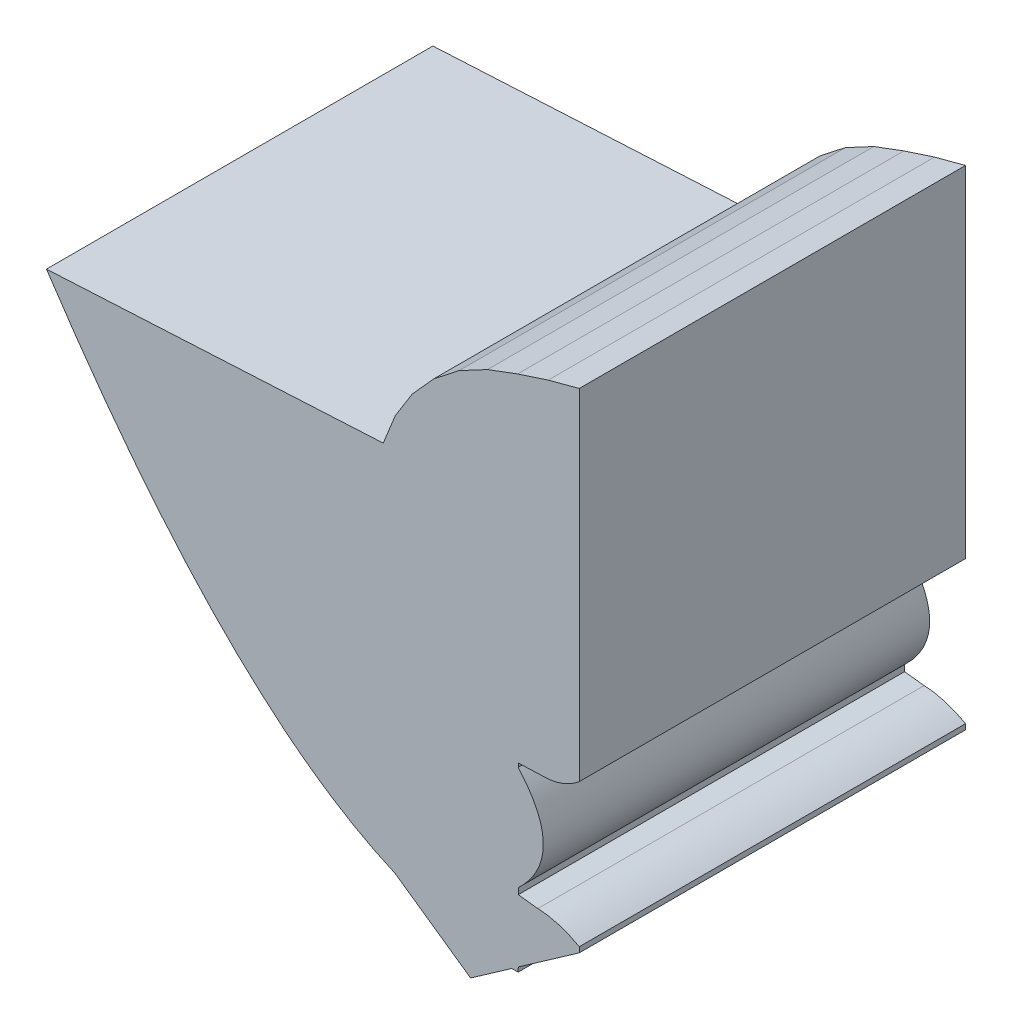
ISO-10303-21;
HEADER;
FILE_DESCRIPTION(('STEP AP214'),'2;1');
FILE_NAME('part.step','',(''),(''),'','','');
FILE_SCHEMA(('AUTOMOTIVE_DESIGN { 1 0 10303 214 1 1 1 1 }'));
ENDSEC;
DATA;
#1=APPLICATION_CONTEXT('core data for automotive mechanical design processes');
#2=APPLICATION_PROTOCOL_DEFINITION('international standard','automotive_design',2000,#1);
#3=PRODUCT_CONTEXT('',#1,'mechanical');
#4=PRODUCT('Part','Part','',(#3));
#5=PRODUCT_RELATED_PRODUCT_CATEGORY('part','',(#4));
#6=PRODUCT_DEFINITION_FORMATION('','',#4);
#7=PRODUCT_DEFINITION_CONTEXT('part definition',#1,'design');
#8=PRODUCT_DEFINITION('design','',#6,#7);
#9=PRODUCT_DEFINITION_SHAPE('','',#8);
#10=(LENGTH_UNIT() NAMED_UNIT(*) SI_UNIT(.MILLI.,.METRE.));
#11=(NAMED_UNIT(*) PLANE_ANGLE_UNIT() SI_UNIT($,.RADIAN.));
#12=(NAMED_UNIT(*) SI_UNIT($,.STERADIAN.) SOLID_ANGLE_UNIT());
#13=UNCERTAINTY_MEASURE_WITH_UNIT(LENGTH_MEASURE(1.E-05),#10,'distance_accuracy_value','');
#14=(GEOMETRIC_REPRESENTATION_CONTEXT(3) GLOBAL_UNCERTAINTY_ASSIGNED_CONTEXT((#13)) GLOBAL_UNIT_ASSIGNED_CONTEXT((#10,
#11,#12)) REPRESENTATION_CONTEXT('',''));
#15=CARTESIAN_POINT('',(0.,0.,0.));
#16=DIRECTION('',(0.,0.,1.));
#17=DIRECTION('',(1.,0.,0.));
#18=AXIS2_PLACEMENT_3D('',#15,#16,#17);
#19=CARTESIAN_POINT('',(-2.17733041778456,0.,7.21));
#20=DIRECTION('',(1.,0.,0.));
#21=DIRECTION('',(0.,1.,0.));
#22=AXIS2_PLACEMENT_3D('',#19,#20,#21);
#23=PLANE('',#22);
#24=DIRECTION('',(0.,1.,0.));
#25=VECTOR('',#24,1.);
#26=CARTESIAN_POINT('',(-2.17733041778456,0.,7.21));
#27=LINE('',#26,#25);
#28=CARTESIAN_POINT('',(-2.17733041779455,-1.68817652024789,7.21));
#29=VERTEX_POINT('',#28);
#30=CARTESIAN_POINT('',(-2.17733041778456,-1.91644819901776,7.21));
#31=VERTEX_POINT('',#30);
#32=EDGE_CURVE('E339',#29,#31,#27,.F.);
#33=ORIENTED_EDGE('',*,*,#32,.T.);
#34=DIRECTION('',(0.,0.,-1.));
#35=VECTOR('',#34,1.);
#36=CARTESIAN_POINT('',(-2.17733041778456,-1.91644819901776,7.21));
#37=LINE('',#36,#35);
#38=CARTESIAN_POINT('',(-2.17733041778456,-1.91644819901776,-7.21));
#39=VERTEX_POINT('',#38);
#40=EDGE_CURVE('E13',#31,#39,#37,.T.);
#41=ORIENTED_EDGE('',*,*,#40,.T.);
#42=DIRECTION('',(0.,1.,0.));
#43=VECTOR('',#42,1.);
#44=CARTESIAN_POINT('',(-2.17733041778456,0.,-7.21));
#45=LINE('',#44,#43);
#46=CARTESIAN_POINT('',(-2.17733041778456,-1.68817652020115,-7.21));
#47=VERTEX_POINT('',#46);
#48=EDGE_CURVE('E238',#47,#39,#45,.F.);
#49=ORIENTED_EDGE('',*,*,#48,.F.);
#50=DIRECTION('',(0.,0.,-1.));
#51=VECTOR('',#50,1.);
#52=CARTESIAN_POINT('',(-2.17733041778328,-1.68817652023794,30.8299178698776));
#53=LINE('',#52,#51);
#54=EDGE_CURVE('E627',#29,#47,#53,.T.);
#55=ORIENTED_EDGE('',*,*,#54,.F.);
#56=EDGE_LOOP('',(#33,#41,#49,#55));
#57=FACE_BOUND('',#56,.T.);
#58=ADVANCED_FACE('F59',(#57),#23,.T.);
#59=CARTESIAN_POINT('',(-2.17733041778456,-4.25341499115567,-7.21));
#60=VERTEX_POINT('',#59);
#61=CARTESIAN_POINT('',(-2.17733041883694,-4.4181521924004,-7.21253661769719));
#62=VERTEX_POINT('',#61);
#63=EDGE_CURVE('E312',#60,#62,#45,.F.);
#64=ORIENTED_EDGE('',*,*,#63,.F.);
#65=DIRECTION('',(0.,0.,1.));
#66=VECTOR('',#65,1.);
#67=CARTESIAN_POINT('',(-2.17733041778456,-4.25341499115567,7.21));
#68=LINE('',#67,#66);
#69=CARTESIAN_POINT('',(-2.17733041778456,-4.25341499115567,7.21));
#70=VERTEX_POINT('',#69);
#71=EDGE_CURVE('E273',#60,#70,#68,.T.);
#72=ORIENTED_EDGE('',*,*,#71,.T.);
#73=CARTESIAN_POINT('',(-2.17733041778728,-4.418152192393,7.21251805157701));
#74=VERTEX_POINT('',#73);
#75=EDGE_CURVE('E317',#70,#74,#27,.F.);
#76=ORIENTED_EDGE('',*,*,#75,.T.);
#77=DIRECTION('',(0.,0.,1.));
#78=VECTOR('',#77,1.);
#79=CARTESIAN_POINT('',(-2.17733041988932,-4.41815219245795,-7.21507323539439));
#80=LINE('',#79,#78);
#81=EDGE_CURVE('E544',#62,#74,#80,.T.);
#82=ORIENTED_EDGE('',*,*,#81,.F.);
#83=EDGE_LOOP('',(#64,#72,#76,#82));
#84=FACE_BOUND('',#83,.T.);
#85=ADVANCED_FACE('F370',(#84),#23,.T.);
#86=CARTESIAN_POINT('',(-82931.1005830976,996560.072871644,30.8299178698776));
#87=CARTESIAN_POINT('',(87153.8887538027,-996199.093812144,30.8299178698776));
#88=CARTESIAN_POINT('',(-91384.0928999308,995820.531871049,30.8299178698776));
#89=B_SPLINE_CURVE_WITH_KNOTS('',2,(#86,#87,#88),.UNSPECIFIED.,.F.,.F.,(3,3),(0.,1.),.UNSPECIFIED.);
#90=DIRECTION('',(0.,0.,-1.));
#91=VECTOR('',#90,1.);
#92=SURFACE_OF_LINEAR_EXTRUSION('',#89,#91);
#93=CARTESIAN_POINT('',(-10.336006015882,-1.39847805226789,-7.21));
#94=CARTESIAN_POINT('',(-8.5284539138062,-2.77531421287891,-7.21));
#95=CARTESIAN_POINT('',(-6.77560980561953,-3.52683514195856,-7.21));
#96=B_SPLINE_CURVE_WITH_KNOTS('',2,(#93,#94,#95),.UNSPECIFIED.,.F.,.F.,(3,3),(0.500568886188035,
0.500965025000237),.UNSPECIFIED.);
#97=CARTESIAN_POINT('',(-10.3360060158632,-1.39847805228234,-7.2125366176972));
#98=VERTEX_POINT('',#97);
#99=CARTESIAN_POINT('',(-6.77560979461232,-3.52683512639348,-7.21));
#100=VERTEX_POINT('',#99);
#101=EDGE_CURVE('E306',#98,#100,#96,.T.);
#102=ORIENTED_EDGE('',*,*,#101,.T.);
#103=DIRECTION('',(0.,0.,-1.));
#104=VECTOR('',#103,1.);
#105=CARTESIAN_POINT('',(-6.77560971984814,-3.52683517873603,0.));
#106=LINE('',#105,#104);
#107=CARTESIAN_POINT('',(-6.77560973251232,-3.52683516987637,7.21));
#108=VERTEX_POINT('',#107);
#109=EDGE_CURVE('E65',#100,#108,#106,.F.);
#110=ORIENTED_EDGE('',*,*,#109,.T.);
#111=CARTESIAN_POINT('',(-6.77560973443359,-3.52683517247104,7.21));
#112=CARTESIAN_POINT('',(-8.52845387710263,-2.7753142408292,7.21));
#113=CARTESIAN_POINT('',(-10.3360060158826,-1.39847805226063,7.21));
#114=B_SPLINE_CURVE_WITH_KNOTS('',2,(#111,#112,#113),.UNSPECIFIED.,.F.,.F.,(3,3),
(0.500568886179991,0.500965025000236),.UNSPECIFIED.);
#115=CARTESIAN_POINT('',(-10.3360060158816,-1.39847805227263,7.21251805157951));
#116=VERTEX_POINT('',#115);
#117=EDGE_CURVE('E474',#116,#108,#114,.F.);
#118=ORIENTED_EDGE('',*,*,#117,.F.);
#119=CARTESIAN_POINT('',(-10.336006015861,-1.39847805228632,7.21));
#120=CARTESIAN_POINT('',(-10.6228848167366,-1.17995870432205,7.21));
#121=CARTESIAN_POINT('',(-10.9111416710362,-0.945688133646021,7.21));
#122=B_SPLINE_CURVE_WITH_KNOTS('',2,(#119,#120,#121),.UNSPECIFIED.,.F.,.F.,(3,3),
(0.500965025000234,0.501027896674745),.UNSPECIFIED.);
#123=CARTESIAN_POINT('',(-10.9111416711035,-0.945688133586594,7.21251805157951));
#124=VERTEX_POINT('',#123);
#125=EDGE_CURVE('E332',#124,#116,#122,.F.);
#126=ORIENTED_EDGE('',*,*,#125,.F.);
#127=CARTESIAN_POINT('',(-10.9111416711694,-0.945688133531575,7.21));
#128=CARTESIAN_POINT('',(-15.1971813204195,2.53763911301365,7.21));
#129=CARTESIAN_POINT('',(-19.7878835648669,9.50327575735757,7.21));
#130=B_SPLINE_CURVE_WITH_KNOTS('',2,(#127,#128,#129),.UNSPECIFIED.,.F.,.F.,(3,3),
(0.501027896674761,0.501962724366634),.UNSPECIFIED.);
#131=CARTESIAN_POINT('',(-19.7878835648708,9.50327575735899,7.21251805157951));
#132=VERTEX_POINT('',#131);
#133=EDGE_CURVE('E347',#132,#124,#130,.F.);
#134=ORIENTED_EDGE('',*,*,#133,.F.);
#135=DIRECTION('',(0.,0.,1.));
#136=VECTOR('',#135,1.);
#137=CARTESIAN_POINT('',(-19.7878835648708,9.50327575735899,-7.21507323539439));
#138=LINE('',#137,#136);
#139=CARTESIAN_POINT('',(-19.7878835648708,9.50327575735899,-7.21253661769719));
#140=VERTEX_POINT('',#139);
#141=EDGE_CURVE('E472',#140,#132,#138,.T.);
#142=ORIENTED_EDGE('',*,*,#141,.F.);
#143=CARTESIAN_POINT('',(-19.7878835648714,9.50327575734023,-7.21));
#144=CARTESIAN_POINT('',(-15.197181319061,2.53763911092818,-7.21));
#145=CARTESIAN_POINT('',(-10.9111416686287,-0.945688135617351,-7.21));
#146=B_SPLINE_CURVE_WITH_KNOTS('',2,(#143,#144,#145),.UNSPECIFIED.,.F.,.F.,(3,3),
(0.501027896674483,0.501962724366634),.UNSPECIFIED.);
#147=CARTESIAN_POINT('',(-10.9111416684846,-0.945688135711886,-7.21253661769719));
#148=VERTEX_POINT('',#147);
#149=EDGE_CURVE('E466',#140,#148,#146,.T.);
#150=ORIENTED_EDGE('',*,*,#149,.T.);
#151=CARTESIAN_POINT('',(-10.9111416684921,-0.945688135713634,-7.21));
#152=CARTESIAN_POINT('',(-10.6228848154707,-1.17995870528634,-7.21));
#153=CARTESIAN_POINT('',(-10.336006015861,-1.39847805228632,-7.21));
#154=B_SPLINE_CURVE_WITH_KNOTS('',2,(#151,#152,#153),.UNSPECIFIED.,.F.,.F.,(3,3),
(0.500965025000234,0.501027896674468),.UNSPECIFIED.);
#155=EDGE_CURVE('E314',#148,#98,#154,.T.);
#156=ORIENTED_EDGE('',*,*,#155,.T.);
#157=EDGE_LOOP('',(#102,#110,#118,#126,#134,#142,#150,#156));
#158=FACE_BOUND('',#157,.T.);
#159=ADVANCED_FACE('F354',(#158),#92,.T.);
#160=CARTESIAN_POINT('',(-2.17733041779322,-4.41815219232809,7.21));
#161=CARTESIAN_POINT('',(-2.30147491297572,-4.42452331167626,7.21));
#162=CARTESIAN_POINT('',(-2.42591830275153,-4.42747805018972,7.21));
#163=B_SPLINE_CURVE_WITH_KNOTS('',2,(#160,#161,#162),.UNSPECIFIED.,.F.,.F.,(3,3),
(0.500038190982026,0.500067471653357),.UNSPECIFIED.);
#164=CARTESIAN_POINT('',(-2.42591825101224,-4.42747806588916,7.21));
#165=VERTEX_POINT('',#164);
#166=EDGE_CURVE('E453',#165,#74,#163,.F.);
#167=ORIENTED_EDGE('',*,*,#166,.F.);
#168=DIRECTION('',(0.,0.,-1.));
#169=VECTOR('',#168,1.);
#170=CARTESIAN_POINT('',(-2.42591822599403,-4.42747804839952,0.));
#171=LINE('',#170,#169);
#172=CARTESIAN_POINT('',(-2.42591830621238,-4.42747805028808,-7.21));
#173=VERTEX_POINT('',#172);
#174=EDGE_CURVE('E302',#165,#173,#171,.T.);
#175=ORIENTED_EDGE('',*,*,#174,.T.);
#176=CARTESIAN_POINT('',(-2.4259183062126,-4.42747805029424,-7.21));
#177=CARTESIAN_POINT('',(-2.30147491575222,-4.42452331181212,-7.21));
#178=CARTESIAN_POINT('',(-2.17733041988843,-4.41815219245793,-7.21));
#179=B_SPLINE_CURVE_WITH_KNOTS('',2,(#176,#177,#178),.UNSPECIFIED.,.F.,.F.,(3,3),
(0.500038190982273,0.500067471653765),.UNSPECIFIED.);
#180=EDGE_CURVE('E292',#173,#62,#179,.T.);
#181=ORIENTED_EDGE('',*,*,#180,.T.);
#182=ORIENTED_EDGE('',*,*,#81,.T.);
#183=EDGE_LOOP('',(#167,#175,#181,#182));
#184=FACE_BOUND('',#183,.T.);
#185=ADVANCED_FACE('F366',(#184),#92,.T.);
#186=DIRECTION('',(0.,1.,0.));
#187=VECTOR('',#186,1.);
#188=CARTESIAN_POINT('',(-2.17733041778456,0.,-7.21));
#189=LINE('',#188,#187);
#190=CARTESIAN_POINT('',(-2.17733041778456,2.34248700715526,-7.21));
#191=VERTEX_POINT('',#190);
#192=CARTESIAN_POINT('',(-2.17733041777607,2.20172974209443,-7.21));
#193=VERTEX_POINT('',#192);
#194=EDGE_CURVE('E326',#191,#193,#189,.F.);
#195=ORIENTED_EDGE('',*,*,#194,.F.);
#196=DIRECTION('',(0.,0.,-1.));
#197=VECTOR('',#196,1.);
#198=CARTESIAN_POINT('',(-2.17733041778456,2.34248700715526,24.0565253000013));
#199=LINE('',#198,#197);
#200=CARTESIAN_POINT('',(-2.17733041778456,2.34248700715526,7.21));
#201=VERTEX_POINT('',#200);
#202=EDGE_CURVE('E533',#201,#191,#199,.T.);
#203=ORIENTED_EDGE('',*,*,#202,.F.);
#204=DIRECTION('',(0.,1.,0.));
#205=VECTOR('',#204,1.);
#206=CARTESIAN_POINT('',(-2.17733041778456,0.,7.21));
#207=LINE('',#206,#205);
#208=CARTESIAN_POINT('',(-2.17733041778074,2.20172974210003,7.21));
#209=VERTEX_POINT('',#208);
#210=EDGE_CURVE('E337',#201,#209,#207,.F.);
#211=ORIENTED_EDGE('',*,*,#210,.T.);
#212=DIRECTION('',(0.,0.,-1.));
#213=VECTOR('',#212,1.);
#214=CARTESIAN_POINT('',(-2.17733041778074,2.20172974210003,30.8299178698776));
#215=LINE('',#214,#213);
#216=EDGE_CURVE('E616',#209,#193,#215,.T.);
#217=ORIENTED_EDGE('',*,*,#216,.T.);
#218=EDGE_LOOP('',(#195,#203,#211,#217));
#219=FACE_BOUND('',#218,.T.);
#220=ADVANCED_FACE('F596',(#219),#23,.T.);
#221=CARTESIAN_POINT('',(0.,0.,7.21));
#222=DIRECTION('',(0.,0.,1.));
#223=DIRECTION('',(1.,0.,0.));
#224=AXIS2_PLACEMENT_3D('',#221,#222,#223);
#225=PLANE('',#224);
#226=ORIENTED_EDGE('',*,*,#75,.F.);
#227=DIRECTION('',(0.819152044288594,0.573576436351615,0.));
#228=VECTOR('',#227,1.);
#229=CARTESIAN_POINT('',(0.100000000004221,-2.65881106562334,7.21));
#230=LINE('',#229,#228);
#231=CARTESIAN_POINT('',(0.100000000004221,-2.65881106562334,7.21));
#232=VERTEX_POINT('',#231);
#233=EDGE_CURVE('E75',#70,#232,#230,.T.);
#234=ORIENTED_EDGE('',*,*,#233,.T.);
#235=DIRECTION('',(-1.62011653008151E-11,1.,0.));
#236=VECTOR('',#235,1.);
#237=CARTESIAN_POINT('',(0.100000000000981,-2.45881106562334,7.21));
#238=LINE('',#237,#236);
#239=CARTESIAN_POINT('',(0.100000000000981,-2.45881106562334,7.21));
#240=VERTEX_POINT('',#239);
#241=EDGE_CURVE('E678',#232,#240,#238,.T.);
#242=ORIENTED_EDGE('',*,*,#241,.T.);
#243=CARTESIAN_POINT('',(-15004.7897636461,-999892.444646946,7.21));
#244=CARTESIAN_POINT('',(17450.906437277,999845.695156391,7.21));
#245=CARTESIAN_POINT('',(-19903.023110908,-999806.945665836,7.21));
#246=B_SPLINE_CURVE_WITH_KNOTS('',2,(#243,#244,#245),.UNSPECIFIED.,.F.,.F.,(3,3),(0.,1.),.UNSPECIFIED.);
#247=CARTESIAN_POINT('',(-1.44765075676889,-2.00137084805176,7.21));
#248=VERTEX_POINT('',#247);
#249=EDGE_CURVE('E683',#240,#248,#246,.T.);
#250=ORIENTED_EDGE('',*,*,#249,.T.);
#251=DIRECTION('',(-0.993295478018601,0.115603171876027,0.));
#252=VECTOR('',#251,1.);
#253=CARTESIAN_POINT('',(-1.44765075676889,-2.00137084805176,7.21));
#254=LINE('',#253,#252);
#255=EDGE_CURVE('E246',#248,#31,#254,.T.);
#256=ORIENTED_EDGE('',*,*,#255,.T.);
#257=ORIENTED_EDGE('',*,*,#32,.F.);
#258=CARTESIAN_POINT('',(-2.17733041777607,2.20172974209443,7.21));
#259=CARTESIAN_POINT('',(-0.307419303310444,0.0931805865995528,7.21));
#260=CARTESIAN_POINT('',(-2.17733041779435,-1.68817652026,7.21));
#261=B_SPLINE_CURVE_WITH_KNOTS('',2,(#258,#259,#260),.UNSPECIFIED.,.F.,.F.,(3,3),
(0.49947186766891,0.500440643667569),.UNSPECIFIED.);
#262=EDGE_CURVE('E650',#209,#29,#261,.T.);
#263=ORIENTED_EDGE('',*,*,#262,.F.);
#264=ORIENTED_EDGE('',*,*,#210,.F.);
#265=DIRECTION('',(0.999390827019096,0.0348994967025048,0.));
#266=VECTOR('',#265,1.);
#267=CARTESIAN_POINT('',(-2.17733041778456,2.34248700715526,7.21));
#268=LINE('',#267,#266);
#269=CARTESIAN_POINT('',(-1.19050164048462,2.37694782742692,7.21000000000002));
#270=VERTEX_POINT('',#269);
#271=EDGE_CURVE('E476',#201,#270,#268,.T.);
#272=ORIENTED_EDGE('',*,*,#271,.T.);
#273=CARTESIAN_POINT('',(-343900.072311573,939011.080499257,7.21000000000001));
#274=CARTESIAN_POINT('',(342019.599581338,-939690.120785908,7.21000000000001));
#275=CARTESIAN_POINT('',(-340141.301828429,940379.16107256,7.21000000000001));
#276=B_SPLINE_CURVE_WITH_KNOTS('',2,(#273,#274,#275),.UNSPECIFIED.,.F.,.F.,(3,3),(0.,1.),.UNSPECIFIED.);
#277=CARTESIAN_POINT('',(0.100000000004221,2.87767341815847,7.21000000000001));
#278=VERTEX_POINT('',#277);
#279=EDGE_CURVE('E475',#270,#278,#276,.T.);
#280=ORIENTED_EDGE('',*,*,#279,.T.);
#281=DIRECTION('',(0.,1.,0.));
#282=VECTOR('',#281,1.);
#283=CARTESIAN_POINT('',(0.100000000004221,2.87767341815847,7.21));
#284=LINE('',#283,#282);
#285=CARTESIAN_POINT('',(0.100000000004747,15.587903347272,7.21));
#286=VERTEX_POINT('',#285);
#287=EDGE_CURVE('E513',#278,#286,#284,.T.);
#288=ORIENTED_EDGE('',*,*,#287,.T.);
#289=DIRECTION('',(-0.96592582628907,-0.258819045102515,0.));
#290=VECTOR('',#289,1.);
#291=CARTESIAN_POINT('',(-1.05911099154214,15.277320493149,7.21));
#292=LINE('',#291,#290);
#293=CARTESIAN_POINT('',(-1.05911099154214,15.277320493149,7.21000000000001));
#294=VERTEX_POINT('',#293);
#295=EDGE_CURVE('E515',#286,#294,#292,.T.);
#296=ORIENTED_EDGE('',*,*,#295,.T.);
#297=DIRECTION('',(-0.951056516295155,-0.309016994374943,0.));
#298=VECTOR('',#297,1.);
#299=CARTESIAN_POINT('',(-2.20037881109632,14.906500099899,7.21));
#300=LINE('',#299,#298);
#301=CARTESIAN_POINT('',(-2.20037881109632,14.906500099899,7.21000000000001));
#302=VERTEX_POINT('',#301);
#303=EDGE_CURVE('E508',#294,#302,#300,.T.);
#304=ORIENTED_EDGE('',*,*,#303,.T.);
#305=DIRECTION('',(-0.9366721892484,-0.350207381259461,0.));
#306=VECTOR('',#305,1.);
#307=CARTESIAN_POINT('',(-3.3243854381944,14.4862512423877,7.21));
#308=LINE('',#307,#306);
#309=CARTESIAN_POINT('',(-3.3243854381944,14.4862512423877,7.21000000000001));
#310=VERTEX_POINT('',#309);
#311=EDGE_CURVE('E506',#302,#310,#308,.T.);
#312=ORIENTED_EDGE('',*,*,#311,.T.);
#313=DIRECTION('',(-0.882947592859007,-0.46947156278574,0.));
#314=VECTOR('',#313,1.);
#315=CARTESIAN_POINT('',(-4.38392254962521,13.9228853670448,7.21));
#316=LINE('',#315,#314);
#317=CARTESIAN_POINT('',(-4.38392254962521,13.9228853670448,7.21000000000001));
#318=VERTEX_POINT('',#317);
#319=EDGE_CURVE('E503',#310,#318,#316,.T.);
#320=ORIENTED_EDGE('',*,*,#319,.T.);
#321=DIRECTION('',(-0.788010753606726,-0.615661475325654,0.));
#322=VECTOR('',#321,1.);
#323=CARTESIAN_POINT('',(-5.32953545395328,13.184091596654,7.21));
#324=LINE('',#323,#322);
#325=CARTESIAN_POINT('',(-5.32953545395328,13.184091596654,7.21000000000001));
#326=VERTEX_POINT('',#325);
#327=EDGE_CURVE('E499',#318,#326,#324,.T.);
#328=ORIENTED_EDGE('',*,*,#327,.T.);
#329=DIRECTION('',(-0.669130606358526,-0.743144825477694,0.));
#330=VECTOR('',#329,1.);
#331=CARTESIAN_POINT('',(-6.13249218158351,12.2923178060808,7.21));
#332=LINE('',#331,#330);
#333=CARTESIAN_POINT('',(-6.13249218158351,12.2923178060808,7.21000000000001));
#334=VERTEX_POINT('',#333);
#335=EDGE_CURVE('E500',#326,#334,#332,.T.);
#336=ORIENTED_EDGE('',*,*,#335,.T.);
#337=DIRECTION('',(-0.52991926423321,-0.848048096156423,0.));
#338=VECTOR('',#337,1.);
#339=CARTESIAN_POINT('',(-6.76839529866336,11.2746600906931,7.21));
#340=LINE('',#339,#338);
#341=CARTESIAN_POINT('',(-6.76839529866336,11.2746600906931,7.21000000000001));
#342=VERTEX_POINT('',#341);
#343=EDGE_CURVE('E494',#334,#342,#340,.T.);
#344=ORIENTED_EDGE('',*,*,#343,.T.);
#345=DIRECTION('',(-0.374606593415918,-0.927183854566785,0.));
#346=VECTOR('',#345,1.);
#347=CARTESIAN_POINT('',(-7.21792321076246,10.1620394652129,7.21));
#348=LINE('',#347,#346);
#349=CARTESIAN_POINT('',(-7.21792321076246,10.1620394652129,7.21000000000001));
#350=VERTEX_POINT('',#349);
#351=EDGE_CURVE('E485',#342,#350,#348,.T.);
#352=ORIENTED_EDGE('',*,*,#351,.T.);
#353=DIRECTION('',(-0.998629534754494,-0.0523359562444688,0.));
#354=VECTOR('',#353,1.);
#355=CARTESIAN_POINT('',(-10.3098203952063,10.,7.21));
#356=LINE('',#355,#354);
#357=EDGE_CURVE('E325',#350,#132,#356,.T.);
#358=ORIENTED_EDGE('',*,*,#357,.T.);
#359=ORIENTED_EDGE('',*,*,#133,.T.);
#360=ORIENTED_EDGE('',*,*,#125,.T.);
#361=ORIENTED_EDGE('',*,*,#117,.T.);
#362=DIRECTION('',(0.819152044288997,-0.573576436351039,0.));
#363=VECTOR('',#362,1.);
#364=CARTESIAN_POINT('',(-10.4506049387458,-0.953575823587159,7.21));
#365=LINE('',#364,#363);
#366=CARTESIAN_POINT('',(-3.95763831339756,-5.5,7.21));
#367=VERTEX_POINT('',#366);
#368=EDGE_CURVE('E276',#108,#367,#365,.T.);
#369=ORIENTED_EDGE('',*,*,#368,.T.);
#370=EDGE_CURVE('E275',#367,#165,#230,.T.);
#371=ORIENTED_EDGE('',*,*,#370,.T.);
#372=ORIENTED_EDGE('',*,*,#166,.T.);
#373=EDGE_LOOP('',(#226,#234,#242,#250,#256,#257,#263,#264,#272,#280,#288,#296,#304,#312,#320,
#328,#336,#344,#352,#358,#359,#360,#361,#369,#371,#372));
#374=FACE_BOUND('',#373,.T.);
#375=ADVANCED_FACE('F428',(#374),#225,.T.);
#376=CARTESIAN_POINT('',(0.,0.,-7.21));
#377=DIRECTION('',(0.,0.,1.));
#378=DIRECTION('',(1.,0.,0.));
#379=AXIS2_PLACEMENT_3D('',#376,#377,#378);
#380=PLANE('',#379);
#381=ORIENTED_EDGE('',*,*,#48,.T.);
#382=DIRECTION('',(0.993295478018601,-0.115603171876027,0.));
#383=VECTOR('',#382,1.);
#384=CARTESIAN_POINT('',(-1.44765075676889,-2.00137084805176,-7.21));
#385=LINE('',#384,#383);
#386=CARTESIAN_POINT('',(-1.44765075676889,-2.00137084805176,-7.21));
#387=VERTEX_POINT('',#386);
#388=EDGE_CURVE('E229',#39,#387,#385,.T.);
#389=ORIENTED_EDGE('',*,*,#388,.T.);
#390=CARTESIAN_POINT('',(-15004.7897636461,-999892.444646946,-7.21));
#391=CARTESIAN_POINT('',(17450.906437277,999845.695156391,-7.21));
#392=CARTESIAN_POINT('',(-19903.023110908,-999806.945665836,-7.21));
#393=B_SPLINE_CURVE_WITH_KNOTS('',2,(#390,#391,#392),.UNSPECIFIED.,.F.,.F.,(3,3),(0.,1.),.UNSPECIFIED.);
#394=CARTESIAN_POINT('',(0.100000000000981,-2.45881106562334,-7.21));
#395=VERTEX_POINT('',#394);
#396=EDGE_CURVE('E232',#387,#395,#393,.F.);
#397=ORIENTED_EDGE('',*,*,#396,.T.);
#398=DIRECTION('',(1.62011653008151E-11,-1.,0.));
#399=VECTOR('',#398,1.);
#400=CARTESIAN_POINT('',(0.100000000000981,-2.45881106562334,-7.21));
#401=LINE('',#400,#399);
#402=CARTESIAN_POINT('',(0.100000000004221,-2.65881106562334,-7.21));
#403=VERTEX_POINT('',#402);
#404=EDGE_CURVE('E254',#395,#403,#401,.T.);
#405=ORIENTED_EDGE('',*,*,#404,.T.);
#406=DIRECTION('',(-0.819152044288594,-0.573576436351615,0.));
#407=VECTOR('',#406,1.);
#408=CARTESIAN_POINT('',(0.100000000004221,-2.65881106562334,-7.21));
#409=LINE('',#408,#407);
#410=EDGE_CURVE('E253',#403,#60,#409,.T.);
#411=ORIENTED_EDGE('',*,*,#410,.T.);
#412=ORIENTED_EDGE('',*,*,#63,.T.);
#413=ORIENTED_EDGE('',*,*,#180,.F.);
#414=CARTESIAN_POINT('',(-3.95763831339756,-5.5,-7.21));
#415=VERTEX_POINT('',#414);
#416=EDGE_CURVE('E78',#173,#415,#409,.T.);
#417=ORIENTED_EDGE('',*,*,#416,.T.);
#418=DIRECTION('',(-0.819152044288997,0.573576436351039,0.));
#419=VECTOR('',#418,1.);
#420=CARTESIAN_POINT('',(-10.4506049387458,-0.953575823587159,-7.21));
#421=LINE('',#420,#419);
#422=EDGE_CURVE('E279',#415,#100,#421,.T.);
#423=ORIENTED_EDGE('',*,*,#422,.T.);
#424=ORIENTED_EDGE('',*,*,#101,.F.);
#425=ORIENTED_EDGE('',*,*,#155,.F.);
#426=ORIENTED_EDGE('',*,*,#149,.F.);
#427=DIRECTION('',(-0.998629534754494,-0.0523359562444688,0.));
#428=VECTOR('',#427,1.);
#429=CARTESIAN_POINT('',(-0.550881453784725,10.5114443180936,-7.21));
#430=LINE('',#429,#428);
#431=CARTESIAN_POINT('',(-7.21792321076246,10.1620394652129,-7.21));
#432=VERTEX_POINT('',#431);
#433=EDGE_CURVE('E462',#432,#140,#430,.T.);
#434=ORIENTED_EDGE('',*,*,#433,.F.);
#435=DIRECTION('',(0.374606593415918,0.927183854566785,0.));
#436=VECTOR('',#435,1.);
#437=CARTESIAN_POINT('',(-7.21792321076246,10.1620394652129,-7.21));
#438=LINE('',#437,#436);
#439=CARTESIAN_POINT('',(-6.76839529866336,11.2746600906931,-7.21));
#440=VERTEX_POINT('',#439);
#441=EDGE_CURVE('E906',#432,#440,#438,.T.);
#442=ORIENTED_EDGE('',*,*,#441,.T.);
#443=DIRECTION('',(0.52991926423321,0.848048096156423,0.));
#444=VECTOR('',#443,1.);
#445=CARTESIAN_POINT('',(-6.76839529866336,11.2746600906931,-7.21));
#446=LINE('',#445,#444);
#447=CARTESIAN_POINT('',(-6.13249218158351,12.2923178060808,-7.21));
#448=VERTEX_POINT('',#447);
#449=EDGE_CURVE('E908',#440,#448,#446,.T.);
#450=ORIENTED_EDGE('',*,*,#449,.T.);
#451=DIRECTION('',(0.669130606358526,0.743144825477694,0.));
#452=VECTOR('',#451,1.);
#453=CARTESIAN_POINT('',(-6.13249218158351,12.2923178060808,-7.21));
#454=LINE('',#453,#452);
#455=CARTESIAN_POINT('',(-5.32953545395328,13.184091596654,-7.21));
#456=VERTEX_POINT('',#455);
#457=EDGE_CURVE('E915',#448,#456,#454,.T.);
#458=ORIENTED_EDGE('',*,*,#457,.T.);
#459=DIRECTION('',(0.788010753606726,0.615661475325654,0.));
#460=VECTOR('',#459,1.);
#461=CARTESIAN_POINT('',(-5.32953545395328,13.184091596654,-7.21));
#462=LINE('',#461,#460);
#463=CARTESIAN_POINT('',(-4.38392254962521,13.9228853670448,-7.21));
#464=VERTEX_POINT('',#463);
#465=EDGE_CURVE('E914',#456,#464,#462,.T.);
#466=ORIENTED_EDGE('',*,*,#465,.T.);
#467=DIRECTION('',(0.882947592859007,0.46947156278574,0.));
#468=VECTOR('',#467,1.);
#469=CARTESIAN_POINT('',(-4.38392254962521,13.9228853670448,-7.21));
#470=LINE('',#469,#468);
#471=CARTESIAN_POINT('',(-3.3243854381944,14.4862512423877,-7.21));
#472=VERTEX_POINT('',#471);
#473=EDGE_CURVE('E918',#464,#472,#470,.T.);
#474=ORIENTED_EDGE('',*,*,#473,.T.);
#475=DIRECTION('',(0.9366721892484,0.350207381259461,0.));
#476=VECTOR('',#475,1.);
#477=CARTESIAN_POINT('',(-3.3243854381944,14.4862512423877,-7.21));
#478=LINE('',#477,#476);
#479=CARTESIAN_POINT('',(-2.20037881109632,14.906500099899,-7.21000000000001));
#480=VERTEX_POINT('',#479);
#481=EDGE_CURVE('E892',#472,#480,#478,.T.);
#482=ORIENTED_EDGE('',*,*,#481,.T.);
#483=DIRECTION('',(0.951056516295155,0.309016994374943,0.));
#484=VECTOR('',#483,1.);
#485=CARTESIAN_POINT('',(-2.20037881109632,14.906500099899,-7.21));
#486=LINE('',#485,#484);
#487=CARTESIAN_POINT('',(-1.05911099154214,15.277320493149,-7.21));
#488=VERTEX_POINT('',#487);
#489=EDGE_CURVE('E487',#480,#488,#486,.T.);
#490=ORIENTED_EDGE('',*,*,#489,.T.);
#491=DIRECTION('',(0.96592582628907,0.258819045102515,0.));
#492=VECTOR('',#491,1.);
#493=CARTESIAN_POINT('',(-1.05911099154214,15.277320493149,-7.21));
#494=LINE('',#493,#492);
#495=CARTESIAN_POINT('',(0.100000000004747,15.587903347272,-7.21));
#496=VERTEX_POINT('',#495);
#497=EDGE_CURVE('E890',#488,#496,#494,.T.);
#498=ORIENTED_EDGE('',*,*,#497,.T.);
#499=DIRECTION('',(0.,-1.,0.));
#500=VECTOR('',#499,1.);
#501=CARTESIAN_POINT('',(0.100000000004221,2.87767341815847,-7.21));
#502=LINE('',#501,#500);
#503=CARTESIAN_POINT('',(0.0999999999995449,2.8776734181557,-7.21000000000001));
#504=VERTEX_POINT('',#503);
#505=EDGE_CURVE('E894',#496,#504,#502,.T.);
#506=ORIENTED_EDGE('',*,*,#505,.T.);
#507=CARTESIAN_POINT('',(-343900.072311573,939011.080499257,-7.21000000000001));
#508=CARTESIAN_POINT('',(342019.599581338,-939690.120785908,-7.21000000000001));
#509=CARTESIAN_POINT('',(-340141.301828429,940379.16107256,-7.21000000000001));
#510=B_SPLINE_CURVE_WITH_KNOTS('',2,(#507,#508,#509),.UNSPECIFIED.,.F.,.F.,(3,3),(0.,1.),.UNSPECIFIED.);
#511=CARTESIAN_POINT('',(-1.19050164048462,2.37694782741517,-7.21));
#512=VERTEX_POINT('',#511);
#513=EDGE_CURVE('E896',#504,#512,#510,.F.);
#514=ORIENTED_EDGE('',*,*,#513,.T.);
#515=DIRECTION('',(-0.999390827019096,-0.0348994967025048,0.));
#516=VECTOR('',#515,1.);
#517=CARTESIAN_POINT('',(-2.17733041778456,2.34248700715526,-7.21));
#518=LINE('',#517,#516);
#519=EDGE_CURVE('E622',#512,#191,#518,.T.);
#520=ORIENTED_EDGE('',*,*,#519,.T.);
#521=ORIENTED_EDGE('',*,*,#194,.T.);
#522=CARTESIAN_POINT('',(-2.17733041776379,-1.68817652023098,-7.21));
#523=CARTESIAN_POINT('',(-0.307419303328964,0.0931805866132554,-7.21));
#524=CARTESIAN_POINT('',(-2.17733041776824,2.20172974208621,-7.21));
#525=B_SPLINE_CURVE_WITH_KNOTS('',2,(#522,#523,#524),.UNSPECIFIED.,.F.,.F.,(3,3),
(0.499471867668912,0.500440643667561),.UNSPECIFIED.);
#526=EDGE_CURVE('E623',#47,#193,#525,.T.);
#527=ORIENTED_EDGE('',*,*,#526,.F.);
#528=EDGE_LOOP('',(#381,#389,#397,#405,#411,#412,#413,#417,#423,#424,#425,#426,#434,#442,#450,
#458,#466,#474,#482,#490,#498,#506,#514,#520,#521,#527));
#529=FACE_BOUND('',#528,.T.);
#530=ADVANCED_FACE('F235',(#529),#380,.F.);
#531=CARTESIAN_POINT('',(-996021.636606251,89148.1321438377,30.8299178698776));
#532=CARTESIAN_POINT('',(996193.448091746,-87155.7427476542,30.8299178698776));
#533=CARTESIAN_POINT('',(-996370.259577241,85163.3533514707,30.8299178698776));
#534=B_SPLINE_CURVE_WITH_KNOTS('',2,(#531,#532,#533),.UNSPECIFIED.,.F.,.F.,(3,3),(0.,1.),.UNSPECIFIED.);
#535=DIRECTION('',(0.,0.,-1.));
#536=VECTOR('',#535,1.);
#537=SURFACE_OF_LINEAR_EXTRUSION('',#534,#536);
#538=ORIENTED_EDGE('',*,*,#216,.F.);
#539=ORIENTED_EDGE('',*,*,#262,.T.);
#540=ORIENTED_EDGE('',*,*,#54,.T.);
#541=ORIENTED_EDGE('',*,*,#526,.T.);
#542=EDGE_LOOP('',(#538,#539,#540,#541));
#543=FACE_BOUND('',#542,.T.);
#544=ADVANCED_FACE('F369',(#543),#537,.T.);
#545=CARTESIAN_POINT('',(-19.7878835648708,9.50327575735899,-7.21507323539439));
#546=DIRECTION('',(-0.0523359562444688,0.998629534754494,0.));
#547=DIRECTION('',(-0.998629534754494,-0.0523359562444688,0.));
#548=AXIS2_PLACEMENT_3D('',#545,#546,#547);
#549=PLANE('',#548);
#550=ORIENTED_EDGE('',*,*,#357,.F.);
#551=DIRECTION('',(0.,0.,-1.));
#552=VECTOR('',#551,1.);
#553=CARTESIAN_POINT('',(-7.21792321076246,10.1620394652129,24.0565253000013));
#554=LINE('',#553,#552);
#555=EDGE_CURVE('E531',#350,#432,#554,.T.);
#556=ORIENTED_EDGE('',*,*,#555,.T.);
#557=ORIENTED_EDGE('',*,*,#433,.T.);
#558=ORIENTED_EDGE('',*,*,#141,.T.);
#559=EDGE_LOOP('',(#550,#556,#557,#558));
#560=FACE_BOUND('',#559,.T.);
#561=ADVANCED_FACE('F368',(#560),#549,.T.);
#562=CARTESIAN_POINT('',(-1.05911099154214,15.277320493149,24.0565253000013));
#563=DIRECTION('',(0.258819045102515,-0.96592582628907,0.));
#564=DIRECTION('',(0.96592582628907,0.258819045102515,0.));
#565=AXIS2_PLACEMENT_3D('',#562,#563,#564);
#566=PLANE('',#565);
#567=ORIENTED_EDGE('',*,*,#295,.F.);
#568=DIRECTION('',(0.,0.,-1.));
#569=VECTOR('',#568,1.);
#570=CARTESIAN_POINT('',(0.100000000004747,15.587903347272,24.0565253000013));
#571=LINE('',#570,#569);
#572=EDGE_CURVE('E523',#286,#496,#571,.T.);
#573=ORIENTED_EDGE('',*,*,#572,.T.);
#574=ORIENTED_EDGE('',*,*,#497,.F.);
#575=DIRECTION('',(0.,0.,-1.));
#576=VECTOR('',#575,1.);
#577=CARTESIAN_POINT('',(-1.05911099154214,15.277320493149,24.0565253000013));
#578=LINE('',#577,#576);
#579=EDGE_CURVE('E519',#294,#488,#578,.T.);
#580=ORIENTED_EDGE('',*,*,#579,.F.);
#581=EDGE_LOOP('',(#567,#573,#574,#580));
#582=FACE_BOUND('',#581,.T.);
#583=ADVANCED_FACE('F586',(#582),#566,.F.);
#584=CARTESIAN_POINT('',(-2.20037881109632,14.906500099899,24.0565253000013));
#585=DIRECTION('',(0.309016994374943,-0.951056516295155,0.));
#586=DIRECTION('',(0.951056516295155,0.309016994374943,0.));
#587=AXIS2_PLACEMENT_3D('',#584,#585,#586);
#588=PLANE('',#587);
#589=ORIENTED_EDGE('',*,*,#303,.F.);
#590=ORIENTED_EDGE('',*,*,#579,.T.);
#591=ORIENTED_EDGE('',*,*,#489,.F.);
#592=DIRECTION('',(0.,0.,-1.));
#593=VECTOR('',#592,1.);
#594=CARTESIAN_POINT('',(-2.20037881109632,14.906500099899,24.0565253000013));
#595=LINE('',#594,#593);
#596=EDGE_CURVE('E520',#302,#480,#595,.T.);
#597=ORIENTED_EDGE('',*,*,#596,.F.);
#598=EDGE_LOOP('',(#589,#590,#591,#597));
#599=FACE_BOUND('',#598,.T.);
#600=ADVANCED_FACE('F585',(#599),#588,.F.);
#601=CARTESIAN_POINT('',(-3.3243854381944,14.4862512423877,24.0565253000013));
#602=DIRECTION('',(0.350207381259461,-0.9366721892484,0.));
#603=DIRECTION('',(0.9366721892484,0.350207381259461,0.));
#604=AXIS2_PLACEMENT_3D('',#601,#602,#603);
#605=PLANE('',#604);
#606=ORIENTED_EDGE('',*,*,#311,.F.);
#607=ORIENTED_EDGE('',*,*,#596,.T.);
#608=ORIENTED_EDGE('',*,*,#481,.F.);
#609=DIRECTION('',(0.,0.,-1.));
#610=VECTOR('',#609,1.);
#611=CARTESIAN_POINT('',(-3.3243854381944,14.4862512423877,24.0565253000013));
#612=LINE('',#611,#610);
#613=EDGE_CURVE('E521',#310,#472,#612,.T.);
#614=ORIENTED_EDGE('',*,*,#613,.F.);
#615=EDGE_LOOP('',(#606,#607,#608,#614));
#616=FACE_BOUND('',#615,.T.);
#617=ADVANCED_FACE('F581',(#616),#605,.F.);
#618=CARTESIAN_POINT('',(-4.38392254962521,13.9228853670448,24.0565253000013));
#619=DIRECTION('',(0.46947156278574,-0.882947592859007,0.));
#620=DIRECTION('',(0.882947592859007,0.46947156278574,0.));
#621=AXIS2_PLACEMENT_3D('',#618,#619,#620);
#622=PLANE('',#621);
#623=ORIENTED_EDGE('',*,*,#319,.F.);
#624=ORIENTED_EDGE('',*,*,#613,.T.);
#625=ORIENTED_EDGE('',*,*,#473,.F.);
#626=DIRECTION('',(0.,0.,-1.));
#627=VECTOR('',#626,1.);
#628=CARTESIAN_POINT('',(-4.38392254962521,13.9228853670448,24.0565253000013));
#629=LINE('',#628,#627);
#630=EDGE_CURVE('E524',#318,#464,#629,.T.);
#631=ORIENTED_EDGE('',*,*,#630,.F.);
#632=EDGE_LOOP('',(#623,#624,#625,#631));
#633=FACE_BOUND('',#632,.T.);
#634=ADVANCED_FACE('F580',(#633),#622,.F.);
#635=CARTESIAN_POINT('',(-5.32953545395328,13.184091596654,24.0565253000013));
#636=DIRECTION('',(0.615661475325654,-0.788010753606726,0.));
#637=DIRECTION('',(0.788010753606726,0.615661475325654,0.));
#638=AXIS2_PLACEMENT_3D('',#635,#636,#637);
#639=PLANE('',#638);
#640=ORIENTED_EDGE('',*,*,#327,.F.);
#641=ORIENTED_EDGE('',*,*,#630,.T.);
#642=ORIENTED_EDGE('',*,*,#465,.F.);
#643=DIRECTION('',(0.,0.,-1.));
#644=VECTOR('',#643,1.);
#645=CARTESIAN_POINT('',(-5.32953545395328,13.184091596654,24.0565253000013));
#646=LINE('',#645,#644);
#647=EDGE_CURVE('E530',#326,#456,#646,.T.);
#648=ORIENTED_EDGE('',*,*,#647,.F.);
#649=EDGE_LOOP('',(#640,#641,#642,#648));
#650=FACE_BOUND('',#649,.T.);
#651=ADVANCED_FACE('F572',(#650),#639,.F.);
#652=CARTESIAN_POINT('',(-6.13249218158351,12.2923178060808,24.0565253000013));
#653=DIRECTION('',(0.743144825477693,-0.669130606358526,0.));
#654=DIRECTION('',(0.669130606358526,0.743144825477694,0.));
#655=AXIS2_PLACEMENT_3D('',#652,#653,#654);
#656=PLANE('',#655);
#657=ORIENTED_EDGE('',*,*,#335,.F.);
#658=ORIENTED_EDGE('',*,*,#647,.T.);
#659=ORIENTED_EDGE('',*,*,#457,.F.);
#660=DIRECTION('',(0.,0.,-1.));
#661=VECTOR('',#660,1.);
#662=CARTESIAN_POINT('',(-6.13249218158351,12.2923178060808,24.0565253000013));
#663=LINE('',#662,#661);
#664=EDGE_CURVE('E529',#334,#448,#663,.T.);
#665=ORIENTED_EDGE('',*,*,#664,.F.);
#666=EDGE_LOOP('',(#657,#658,#659,#665));
#667=FACE_BOUND('',#666,.T.);
#668=ADVANCED_FACE('F567',(#667),#656,.F.);
#669=CARTESIAN_POINT('',(-6.76839529866336,11.2746600906931,24.0565253000013));
#670=DIRECTION('',(0.848048096156423,-0.52991926423321,0.));
#671=DIRECTION('',(0.52991926423321,0.848048096156423,0.));
#672=AXIS2_PLACEMENT_3D('',#669,#670,#671);
#673=PLANE('',#672);
#674=ORIENTED_EDGE('',*,*,#343,.F.);
#675=ORIENTED_EDGE('',*,*,#664,.T.);
#676=ORIENTED_EDGE('',*,*,#449,.F.);
#677=DIRECTION('',(0.,0.,-1.));
#678=VECTOR('',#677,1.);
#679=CARTESIAN_POINT('',(-6.76839529866336,11.2746600906931,24.0565253000013));
#680=LINE('',#679,#678);
#681=EDGE_CURVE('E532',#342,#440,#680,.T.);
#682=ORIENTED_EDGE('',*,*,#681,.F.);
#683=EDGE_LOOP('',(#674,#675,#676,#682));
#684=FACE_BOUND('',#683,.T.);
#685=ADVANCED_FACE('F564',(#684),#673,.F.);
#686=CARTESIAN_POINT('',(-7.21792321076246,10.1620394652129,24.0565253000013));
#687=DIRECTION('',(0.927183854566785,-0.374606593415918,0.));
#688=DIRECTION('',(0.374606593415918,0.927183854566785,0.));
#689=AXIS2_PLACEMENT_3D('',#686,#687,#688);
#690=PLANE('',#689);
#691=ORIENTED_EDGE('',*,*,#351,.F.);
#692=ORIENTED_EDGE('',*,*,#681,.T.);
#693=ORIENTED_EDGE('',*,*,#441,.F.);
#694=ORIENTED_EDGE('',*,*,#555,.F.);
#695=EDGE_LOOP('',(#691,#692,#693,#694));
#696=FACE_BOUND('',#695,.T.);
#697=ADVANCED_FACE('F561',(#696),#690,.F.);
#698=CARTESIAN_POINT('',(-2.17733041778456,2.34248700715526,24.0565253000013));
#699=DIRECTION('',(-0.0348994967025048,0.999390827019096,0.));
#700=DIRECTION('',(-0.999390827019096,-0.0348994967025048,0.));
#701=AXIS2_PLACEMENT_3D('',#698,#699,#700);
#702=PLANE('',#701);
#703=ORIENTED_EDGE('',*,*,#271,.F.);
#704=ORIENTED_EDGE('',*,*,#202,.T.);
#705=ORIENTED_EDGE('',*,*,#519,.F.);
#706=DIRECTION('',(0.,0.,-1.));
#707=VECTOR('',#706,1.);
#708=CARTESIAN_POINT('',(-1.19050164048462,2.37694782742692,24.0565253000013));
#709=LINE('',#708,#707);
#710=EDGE_CURVE('E537',#270,#512,#709,.T.);
#711=ORIENTED_EDGE('',*,*,#710,.F.);
#712=EDGE_LOOP('',(#703,#704,#705,#711));
#713=FACE_BOUND('',#712,.T.);
#714=ADVANCED_FACE('F558',(#713),#702,.F.);
#715=CARTESIAN_POINT('',(-343900.072311573,939011.080499257,24.0565253000013));
#716=CARTESIAN_POINT('',(342019.599581338,-939690.120785908,24.0565253000013));
#717=CARTESIAN_POINT('',(-340141.301828429,940379.16107256,24.0565253000013));
#718=B_SPLINE_CURVE_WITH_KNOTS('',2,(#715,#716,#717),.UNSPECIFIED.,.F.,.F.,(3,3),(0.,1.),.UNSPECIFIED.);
#719=DIRECTION('',(0.,0.,-1.));
#720=VECTOR('',#719,1.);
#721=SURFACE_OF_LINEAR_EXTRUSION('',#718,#720);
#722=ORIENTED_EDGE('',*,*,#279,.F.);
#723=ORIENTED_EDGE('',*,*,#710,.T.);
#724=ORIENTED_EDGE('',*,*,#513,.F.);
#725=DIRECTION('',(0.,0.,-1.));
#726=VECTOR('',#725,1.);
#727=CARTESIAN_POINT('',(0.100000000004221,2.87767341815847,24.0565253000013));
#728=LINE('',#727,#726);
#729=EDGE_CURVE('E517',#278,#504,#728,.T.);
#730=ORIENTED_EDGE('',*,*,#729,.F.);
#731=EDGE_LOOP('',(#722,#723,#724,#730));
#732=FACE_BOUND('',#731,.T.);
#733=ADVANCED_FACE('F553',(#732),#721,.F.);
#734=CARTESIAN_POINT('',(0.100000000004221,2.87767341815847,24.0565253000013));
#735=DIRECTION('',(-1.,0.,0.));
#736=DIRECTION('',(0.,-1.,0.));
#737=AXIS2_PLACEMENT_3D('',#734,#735,#736);
#738=PLANE('',#737);
#739=ORIENTED_EDGE('',*,*,#287,.F.);
#740=ORIENTED_EDGE('',*,*,#729,.T.);
#741=ORIENTED_EDGE('',*,*,#505,.F.);
#742=ORIENTED_EDGE('',*,*,#572,.F.);
#743=EDGE_LOOP('',(#739,#740,#741,#742));
#744=FACE_BOUND('',#743,.T.);
#745=ADVANCED_FACE('F554',(#744),#738,.F.);
#746=CARTESIAN_POINT('',(0.100000000004221,-2.65881106562334,18.6984828139075));
#747=DIRECTION('',(-0.573576436351615,0.819152044288594,0.));
#748=DIRECTION('',(-0.819152044288594,-0.573576436351615,0.));
#749=AXIS2_PLACEMENT_3D('',#746,#747,#748);
#750=PLANE('',#749);
#751=ORIENTED_EDGE('',*,*,#174,.F.);
#752=ORIENTED_EDGE('',*,*,#370,.F.);
#753=DIRECTION('',(0.,0.,-1.));
#754=VECTOR('',#753,1.);
#755=CARTESIAN_POINT('',(-3.95763831339756,-5.5,18.6984828139075));
#756=LINE('',#755,#754);
#757=EDGE_CURVE('E249',#367,#415,#756,.T.);
#758=ORIENTED_EDGE('',*,*,#757,.T.);
#759=ORIENTED_EDGE('',*,*,#416,.F.);
#760=EDGE_LOOP('',(#751,#752,#758,#759));
#761=FACE_BOUND('',#760,.T.);
#762=ADVANCED_FACE('F298',(#761),#750,.F.);
#763=CARTESIAN_POINT('',(-10.4506049387458,-0.953575823587159,18.6984828139075));
#764=DIRECTION('',(0.573576436351039,0.819152044288997,0.));
#765=DIRECTION('',(-0.819152044288997,0.573576436351039,0.));
#766=AXIS2_PLACEMENT_3D('',#763,#764,#765);
#767=PLANE('',#766);
#768=ORIENTED_EDGE('',*,*,#109,.F.);
#769=ORIENTED_EDGE('',*,*,#422,.F.);
#770=ORIENTED_EDGE('',*,*,#757,.F.);
#771=ORIENTED_EDGE('',*,*,#368,.F.);
#772=EDGE_LOOP('',(#768,#769,#770,#771));
#773=FACE_BOUND('',#772,.T.);
#774=ADVANCED_FACE('F297',(#773),#767,.F.);
#775=ORIENTED_EDGE('',*,*,#71,.F.);
#776=ORIENTED_EDGE('',*,*,#410,.F.);
#777=DIRECTION('',(0.,0.,-1.));
#778=VECTOR('',#777,1.);
#779=CARTESIAN_POINT('',(0.100000000004221,-2.65881106562334,18.6984828139075));
#780=LINE('',#779,#778);
#781=EDGE_CURVE('E296',#232,#403,#780,.T.);
#782=ORIENTED_EDGE('',*,*,#781,.F.);
#783=ORIENTED_EDGE('',*,*,#233,.F.);
#784=EDGE_LOOP('',(#775,#776,#782,#783));
#785=FACE_BOUND('',#784,.T.);
#786=ADVANCED_FACE('F680',(#785),#750,.F.);
#787=CARTESIAN_POINT('',(-15004.7897636461,-999892.444646946,18.6984828139075));
#788=CARTESIAN_POINT('',(17450.906437277,999845.695156391,18.6984828139075));
#789=CARTESIAN_POINT('',(-19903.023110908,-999806.945665836,18.6984828139075));
#790=B_SPLINE_CURVE_WITH_KNOTS('',2,(#787,#788,#789),.UNSPECIFIED.,.F.,.F.,(3,3),(0.,1.),.UNSPECIFIED.);
#791=DIRECTION('',(0.,0.,-1.));
#792=VECTOR('',#791,1.);
#793=SURFACE_OF_LINEAR_EXTRUSION('',#790,#792);
#794=ORIENTED_EDGE('',*,*,#249,.F.);
#795=DIRECTION('',(0.,0.,-1.));
#796=VECTOR('',#795,1.);
#797=CARTESIAN_POINT('',(0.100000000000981,-2.45881106562334,18.6984828139075));
#798=LINE('',#797,#796);
#799=EDGE_CURVE('E239',#240,#395,#798,.T.);
#800=ORIENTED_EDGE('',*,*,#799,.T.);
#801=ORIENTED_EDGE('',*,*,#396,.F.);
#802=DIRECTION('',(0.,0.,-1.));
#803=VECTOR('',#802,1.);
#804=CARTESIAN_POINT('',(-1.44765075676889,-2.00137084805176,18.6984828139075));
#805=LINE('',#804,#803);
#806=EDGE_CURVE('E243',#248,#387,#805,.T.);
#807=ORIENTED_EDGE('',*,*,#806,.F.);
#808=EDGE_LOOP('',(#794,#800,#801,#807));
#809=FACE_BOUND('',#808,.T.);
#810=ADVANCED_FACE('F255',(#809),#793,.F.);
#811=CARTESIAN_POINT('',(-1.44765075676889,-2.00137084805176,18.6984828139075));
#812=DIRECTION('',(-0.115603171876027,-0.993295478018601,0.));
#813=DIRECTION('',(0.993295478018601,-0.115603171876027,0.));
#814=AXIS2_PLACEMENT_3D('',#811,#812,#813);
#815=PLANE('',#814);
#816=ORIENTED_EDGE('',*,*,#40,.F.);
#817=ORIENTED_EDGE('',*,*,#255,.F.);
#818=ORIENTED_EDGE('',*,*,#806,.T.);
#819=ORIENTED_EDGE('',*,*,#388,.F.);
#820=EDGE_LOOP('',(#816,#817,#818,#819));
#821=FACE_BOUND('',#820,.T.);
#822=ADVANCED_FACE('F242',(#821),#815,.F.);
#823=CARTESIAN_POINT('',(0.100000000000981,-2.45881106562334,18.6984828139075));
#824=DIRECTION('',(-1.,-1.62011653008151E-11,0.));
#825=DIRECTION('',(1.62011653008151E-11,-1.,0.));
#826=AXIS2_PLACEMENT_3D('',#823,#824,#825);
#827=PLANE('',#826);
#828=ORIENTED_EDGE('',*,*,#241,.F.);
#829=ORIENTED_EDGE('',*,*,#781,.T.);
#830=ORIENTED_EDGE('',*,*,#404,.F.);
#831=ORIENTED_EDGE('',*,*,#799,.F.);
#832=EDGE_LOOP('',(#828,#829,#830,#831));
#833=FACE_BOUND('',#832,.T.);
#834=ADVANCED_FACE('F679',(#833),#827,.F.);
#835=CLOSED_SHELL('',(#58,#85,#159,#185,#220,#375,#530,#544,#561,#583,#600,#617,#634,#651,#668,
#685,#697,#714,#733,#745,#762,#774,#786,#810,#822,#834));
#836=MANIFOLD_SOLID_BREP('B2',#835);
#837=ADVANCED_BREP_SHAPE_REPRESENTATION('',(#18,#836),#14);
#838=SHAPE_DEFINITION_REPRESENTATION(#9,#837);
ENDSEC;
END-ISO-10303-21;
